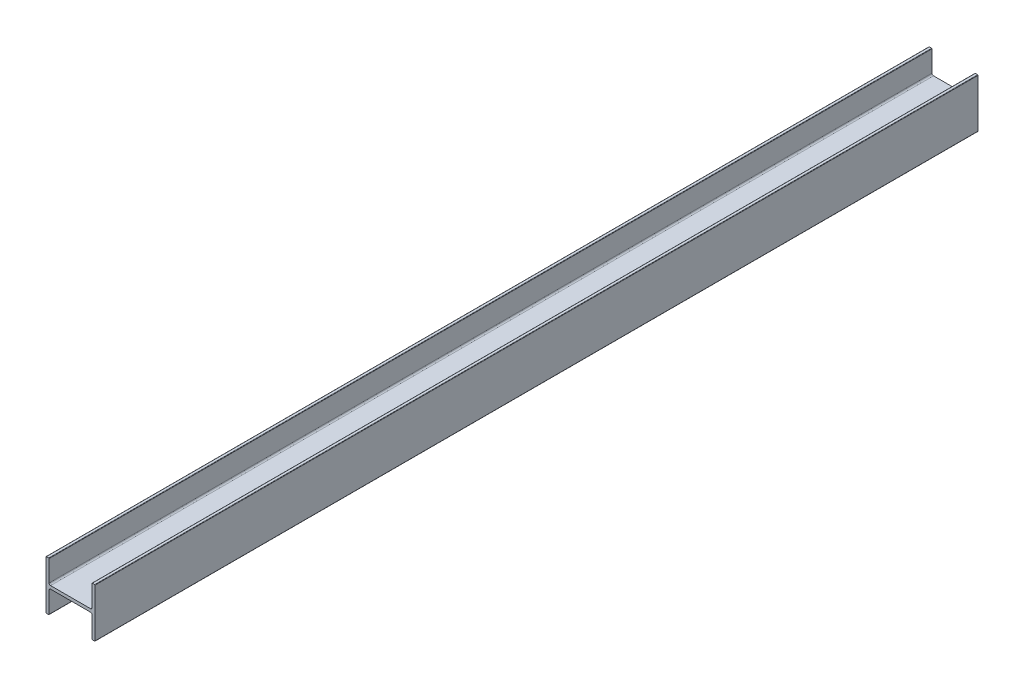
ISO-10303-21;
HEADER;
FILE_DESCRIPTION(('STEP AP214'),'2;1');
FILE_NAME('part.step','',(''),(''),'','','');
FILE_SCHEMA(('AUTOMOTIVE_DESIGN { 1 0 10303 214 1 1 1 1 }'));
ENDSEC;
DATA;
#1=APPLICATION_CONTEXT('core data for automotive mechanical design processes');
#2=APPLICATION_PROTOCOL_DEFINITION('international standard','automotive_design',2000,#1);
#3=PRODUCT_CONTEXT('',#1,'mechanical');
#4=PRODUCT('Part','Part','',(#3));
#5=PRODUCT_RELATED_PRODUCT_CATEGORY('part','',(#4));
#6=PRODUCT_DEFINITION_FORMATION('','',#4);
#7=PRODUCT_DEFINITION_CONTEXT('part definition',#1,'design');
#8=PRODUCT_DEFINITION('design','',#6,#7);
#9=PRODUCT_DEFINITION_SHAPE('','',#8);
#10=(LENGTH_UNIT() NAMED_UNIT(*) SI_UNIT(.MILLI.,.METRE.));
#11=(NAMED_UNIT(*) PLANE_ANGLE_UNIT() SI_UNIT($,.RADIAN.));
#12=(NAMED_UNIT(*) SI_UNIT($,.STERADIAN.) SOLID_ANGLE_UNIT());
#13=UNCERTAINTY_MEASURE_WITH_UNIT(LENGTH_MEASURE(1.E-05),#10,'distance_accuracy_value','');
#14=(GEOMETRIC_REPRESENTATION_CONTEXT(3) GLOBAL_UNCERTAINTY_ASSIGNED_CONTEXT((#13)) GLOBAL_UNIT_ASSIGNED_CONTEXT((#10,
#11,#12)) REPRESENTATION_CONTEXT('',''));
#15=CARTESIAN_POINT('',(0.,0.,0.));
#16=DIRECTION('',(0.,0.,1.));
#17=DIRECTION('',(1.,0.,0.));
#18=AXIS2_PLACEMENT_3D('',#15,#16,#17);
#19=CARTESIAN_POINT('',(22.225,-25.4,457.2));
#20=DIRECTION('',(0.,1.,0.));
#21=DIRECTION('',(-1.,0.,0.));
#22=AXIS2_PLACEMENT_3D('',#19,#20,#21);
#23=PLANE('',#22);
#24=DIRECTION('',(1.,0.,0.));
#25=VECTOR('',#24,1.);
#26=CARTESIAN_POINT('',(22.225,-25.4,-457.2));
#27=LINE('',#26,#25);
#28=CARTESIAN_POINT('',(22.621875,-25.4,-457.2));
#29=VERTEX_POINT('',#28);
#30=CARTESIAN_POINT('',(25.003125,-25.4,-457.2));
#31=VERTEX_POINT('',#30);
#32=EDGE_CURVE('E404',#29,#31,#27,.T.);
#33=ORIENTED_EDGE('',*,*,#32,.T.);
#34=DIRECTION('',(0.,0.,-1.));
#35=VECTOR('',#34,1.);
#36=CARTESIAN_POINT('',(25.003125,-25.4,457.2));
#37=LINE('',#36,#35);
#38=CARTESIAN_POINT('',(25.003125,-25.4,457.2));
#39=VERTEX_POINT('',#38);
#40=EDGE_CURVE('E325',#31,#39,#37,.F.);
#41=ORIENTED_EDGE('',*,*,#40,.T.);
#42=DIRECTION('',(1.,0.,0.));
#43=VECTOR('',#42,1.);
#44=CARTESIAN_POINT('',(22.225,-25.4,457.2));
#45=LINE('',#44,#43);
#46=CARTESIAN_POINT('',(22.621875,-25.4,457.2));
#47=VERTEX_POINT('',#46);
#48=EDGE_CURVE('E232',#47,#39,#45,.T.);
#49=ORIENTED_EDGE('',*,*,#48,.F.);
#50=DIRECTION('',(0.,0.,-1.));
#51=VECTOR('',#50,1.);
#52=CARTESIAN_POINT('',(22.621875,-25.4,457.2));
#53=LINE('',#52,#51);
#54=EDGE_CURVE('E316',#47,#29,#53,.T.);
#55=ORIENTED_EDGE('',*,*,#54,.T.);
#56=EDGE_LOOP('',(#33,#41,#49,#55));
#57=FACE_BOUND('',#56,.T.);
#58=ADVANCED_FACE('F41',(#57),#23,.F.);
#59=CARTESIAN_POINT('',(25.4,-25.4,457.2));
#60=DIRECTION('',(-1.,0.,0.));
#61=DIRECTION('',(0.,-1.,0.));
#62=AXIS2_PLACEMENT_3D('',#59,#60,#61);
#63=PLANE('',#62);
#64=DIRECTION('',(0.,1.,0.));
#65=VECTOR('',#64,1.);
#66=CARTESIAN_POINT('',(25.4,-25.4,457.2));
#67=LINE('',#66,#65);
#68=CARTESIAN_POINT('',(25.4,-25.003125,457.2));
#69=VERTEX_POINT('',#68);
#70=CARTESIAN_POINT('',(25.4,25.003125,457.2));
#71=VERTEX_POINT('',#70);
#72=EDGE_CURVE('E243',#69,#71,#67,.T.);
#73=ORIENTED_EDGE('',*,*,#72,.F.);
#74=DIRECTION('',(0.,0.,-1.));
#75=VECTOR('',#74,1.);
#76=CARTESIAN_POINT('',(25.4,-25.003125,457.2));
#77=LINE('',#76,#75);
#78=CARTESIAN_POINT('',(25.4,-25.003125,-457.2));
#79=VERTEX_POINT('',#78);
#80=EDGE_CURVE('E297',#69,#79,#77,.T.);
#81=ORIENTED_EDGE('',*,*,#80,.T.);
#82=DIRECTION('',(0.,1.,0.));
#83=VECTOR('',#82,1.);
#84=CARTESIAN_POINT('',(25.4,-25.4,-457.2));
#85=LINE('',#84,#83);
#86=CARTESIAN_POINT('',(25.4,25.003125,-457.2));
#87=VERTEX_POINT('',#86);
#88=EDGE_CURVE('E420',#79,#87,#85,.T.);
#89=ORIENTED_EDGE('',*,*,#88,.T.);
#90=DIRECTION('',(0.,0.,-1.));
#91=VECTOR('',#90,1.);
#92=CARTESIAN_POINT('',(25.4,25.003125,457.2));
#93=LINE('',#92,#91);
#94=EDGE_CURVE('E296',#87,#71,#93,.F.);
#95=ORIENTED_EDGE('',*,*,#94,.T.);
#96=EDGE_LOOP('',(#73,#81,#89,#95));
#97=FACE_BOUND('',#96,.T.);
#98=ADVANCED_FACE('F418',(#97),#63,.F.);
#99=CARTESIAN_POINT('',(25.4,25.4,457.2));
#100=DIRECTION('',(0.,-1.,0.));
#101=DIRECTION('',(1.,0.,0.));
#102=AXIS2_PLACEMENT_3D('',#99,#100,#101);
#103=PLANE('',#102);
#104=DIRECTION('',(-1.,0.,0.));
#105=VECTOR('',#104,1.);
#106=CARTESIAN_POINT('',(25.4,25.4,457.2));
#107=LINE('',#106,#105);
#108=CARTESIAN_POINT('',(25.003125,25.4,457.2));
#109=VERTEX_POINT('',#108);
#110=CARTESIAN_POINT('',(22.621875,25.4,457.2));
#111=VERTEX_POINT('',#110);
#112=EDGE_CURVE('E246',#109,#111,#107,.T.);
#113=ORIENTED_EDGE('',*,*,#112,.F.);
#114=DIRECTION('',(0.,0.,-1.));
#115=VECTOR('',#114,1.);
#116=CARTESIAN_POINT('',(25.003125,25.4,457.2));
#117=LINE('',#116,#115);
#118=CARTESIAN_POINT('',(25.003125,25.4,-457.2));
#119=VERTEX_POINT('',#118);
#120=EDGE_CURVE('E355',#109,#119,#117,.T.);
#121=ORIENTED_EDGE('',*,*,#120,.T.);
#122=DIRECTION('',(-1.,0.,0.));
#123=VECTOR('',#122,1.);
#124=CARTESIAN_POINT('',(25.4,25.4,-457.2));
#125=LINE('',#124,#123);
#126=CARTESIAN_POINT('',(22.621875,25.4,-457.2));
#127=VERTEX_POINT('',#126);
#128=EDGE_CURVE('E421',#119,#127,#125,.T.);
#129=ORIENTED_EDGE('',*,*,#128,.T.);
#130=DIRECTION('',(0.,0.,-1.));
#131=VECTOR('',#130,1.);
#132=CARTESIAN_POINT('',(22.621875,25.4,457.2));
#133=LINE('',#132,#131);
#134=EDGE_CURVE('E354',#127,#111,#133,.F.);
#135=ORIENTED_EDGE('',*,*,#134,.T.);
#136=EDGE_LOOP('',(#113,#121,#129,#135));
#137=FACE_BOUND('',#136,.T.);
#138=ADVANCED_FACE('F472',(#137),#103,.F.);
#139=CARTESIAN_POINT('',(22.225,25.4,457.2));
#140=DIRECTION('',(1.,0.,0.));
#141=DIRECTION('',(0.,1.,0.));
#142=AXIS2_PLACEMENT_3D('',#139,#140,#141);
#143=PLANE('',#142);
#144=DIRECTION('',(0.,-1.,0.));
#145=VECTOR('',#144,1.);
#146=CARTESIAN_POINT('',(22.225,25.4,457.2));
#147=LINE('',#146,#145);
#148=CARTESIAN_POINT('',(22.225,25.003125,457.2));
#149=VERTEX_POINT('',#148);
#150=CARTESIAN_POINT('',(22.225,3.17499999999999,457.2));
#151=VERTEX_POINT('',#150);
#152=EDGE_CURVE('E248',#149,#151,#147,.T.);
#153=ORIENTED_EDGE('',*,*,#152,.F.);
#154=DIRECTION('',(0.,0.,-1.));
#155=VECTOR('',#154,1.);
#156=CARTESIAN_POINT('',(22.225,25.003125,457.2));
#157=LINE('',#156,#155);
#158=CARTESIAN_POINT('',(22.225,25.003125,-457.2));
#159=VERTEX_POINT('',#158);
#160=EDGE_CURVE('E356',#149,#159,#157,.T.);
#161=ORIENTED_EDGE('',*,*,#160,.T.);
#162=DIRECTION('',(0.,-1.,0.));
#163=VECTOR('',#162,1.);
#164=CARTESIAN_POINT('',(22.225,25.4,-457.2));
#165=LINE('',#164,#163);
#166=CARTESIAN_POINT('',(22.225,3.17499999999999,-457.2));
#167=VERTEX_POINT('',#166);
#168=EDGE_CURVE('E428',#159,#167,#165,.T.);
#169=ORIENTED_EDGE('',*,*,#168,.T.);
#170=DIRECTION('',(0.,0.,-1.));
#171=VECTOR('',#170,1.);
#172=CARTESIAN_POINT('',(22.225,3.17499999999999,457.2));
#173=LINE('',#172,#171);
#174=EDGE_CURVE('E279',#167,#151,#173,.F.);
#175=ORIENTED_EDGE('',*,*,#174,.T.);
#176=EDGE_LOOP('',(#153,#161,#169,#175));
#177=FACE_BOUND('',#176,.T.);
#178=ADVANCED_FACE('F545',(#177),#143,.F.);
#179=CARTESIAN_POINT('',(22.225,1.58749999999999,457.2));
#180=DIRECTION('',(0.,-1.,0.));
#181=DIRECTION('',(1.,0.,0.));
#182=AXIS2_PLACEMENT_3D('',#179,#180,#181);
#183=PLANE('',#182);
#184=DIRECTION('',(-1.,0.,0.));
#185=VECTOR('',#184,1.);
#186=CARTESIAN_POINT('',(22.225,1.58749999999999,457.2));
#187=LINE('',#186,#185);
#188=CARTESIAN_POINT('',(20.6375,1.58749999999999,457.2));
#189=VERTEX_POINT('',#188);
#190=CARTESIAN_POINT('',(-20.6375,1.5875,457.2));
#191=VERTEX_POINT('',#190);
#192=EDGE_CURVE('E252',#189,#191,#187,.T.);
#193=ORIENTED_EDGE('',*,*,#192,.F.);
#194=DIRECTION('',(0.,0.,-1.));
#195=VECTOR('',#194,1.);
#196=CARTESIAN_POINT('',(20.6375,1.58749999999999,-457.2));
#197=LINE('',#196,#195);
#198=CARTESIAN_POINT('',(20.6375,1.58749999999999,-457.2));
#199=VERTEX_POINT('',#198);
#200=EDGE_CURVE('E280',#189,#199,#197,.T.);
#201=ORIENTED_EDGE('',*,*,#200,.T.);
#202=DIRECTION('',(-1.,0.,0.));
#203=VECTOR('',#202,1.);
#204=CARTESIAN_POINT('',(22.225,1.58749999999999,-457.2));
#205=LINE('',#204,#203);
#206=CARTESIAN_POINT('',(-20.6375,1.5875,-457.2));
#207=VERTEX_POINT('',#206);
#208=EDGE_CURVE('E382',#199,#207,#205,.T.);
#209=ORIENTED_EDGE('',*,*,#208,.T.);
#210=DIRECTION('',(0.,0.,-1.));
#211=VECTOR('',#210,1.);
#212=CARTESIAN_POINT('',(-20.6375,1.5875,457.2));
#213=LINE('',#212,#211);
#214=EDGE_CURVE('E273',#207,#191,#213,.F.);
#215=ORIENTED_EDGE('',*,*,#214,.T.);
#216=EDGE_LOOP('',(#193,#201,#209,#215));
#217=FACE_BOUND('',#216,.T.);
#218=ADVANCED_FACE('F434',(#217),#183,.F.);
#219=CARTESIAN_POINT('',(-22.225,1.5875,457.2));
#220=DIRECTION('',(-1.,0.,0.));
#221=DIRECTION('',(0.,-1.,0.));
#222=AXIS2_PLACEMENT_3D('',#219,#220,#221);
#223=PLANE('',#222);
#224=DIRECTION('',(0.,1.,0.));
#225=VECTOR('',#224,1.);
#226=CARTESIAN_POINT('',(-22.225,1.5875,-457.2));
#227=LINE('',#226,#225);
#228=CARTESIAN_POINT('',(-22.225,3.175,-457.2));
#229=VERTEX_POINT('',#228);
#230=CARTESIAN_POINT('',(-22.225,25.003125,-457.2));
#231=VERTEX_POINT('',#230);
#232=EDGE_CURVE('E380',#229,#231,#227,.T.);
#233=ORIENTED_EDGE('',*,*,#232,.T.);
#234=DIRECTION('',(0.,0.,-1.));
#235=VECTOR('',#234,1.);
#236=CARTESIAN_POINT('',(-22.225,25.003125,457.2));
#237=LINE('',#236,#235);
#238=CARTESIAN_POINT('',(-22.225,25.003125,457.2));
#239=VERTEX_POINT('',#238);
#240=EDGE_CURVE('E11',#231,#239,#237,.F.);
#241=ORIENTED_EDGE('',*,*,#240,.T.);
#242=DIRECTION('',(0.,1.,0.));
#243=VECTOR('',#242,1.);
#244=CARTESIAN_POINT('',(-22.225,1.5875,457.2));
#245=LINE('',#244,#243);
#246=CARTESIAN_POINT('',(-22.225,3.175,457.2));
#247=VERTEX_POINT('',#246);
#248=EDGE_CURVE('E251',#247,#239,#245,.T.);
#249=ORIENTED_EDGE('',*,*,#248,.F.);
#250=DIRECTION('',(0.,0.,-1.));
#251=VECTOR('',#250,1.);
#252=CARTESIAN_POINT('',(-22.225,3.175,-457.2));
#253=LINE('',#252,#251);
#254=EDGE_CURVE('E217',#247,#229,#253,.T.);
#255=ORIENTED_EDGE('',*,*,#254,.T.);
#256=EDGE_LOOP('',(#233,#241,#249,#255));
#257=FACE_BOUND('',#256,.T.);
#258=ADVANCED_FACE('F442',(#257),#223,.F.);
#259=CARTESIAN_POINT('',(-22.225,25.4,457.2));
#260=DIRECTION('',(0.,-1.,0.));
#261=DIRECTION('',(1.,0.,0.));
#262=AXIS2_PLACEMENT_3D('',#259,#260,#261);
#263=PLANE('',#262);
#264=DIRECTION('',(-1.,0.,0.));
#265=VECTOR('',#264,1.);
#266=CARTESIAN_POINT('',(-22.225,25.4,457.2));
#267=LINE('',#266,#265);
#268=CARTESIAN_POINT('',(-22.621875,25.4,457.2));
#269=VERTEX_POINT('',#268);
#270=CARTESIAN_POINT('',(-25.003125,25.4,457.2));
#271=VERTEX_POINT('',#270);
#272=EDGE_CURVE('E260',#269,#271,#267,.T.);
#273=ORIENTED_EDGE('',*,*,#272,.F.);
#274=DIRECTION('',(0.,0.,-1.));
#275=VECTOR('',#274,1.);
#276=CARTESIAN_POINT('',(-22.621875,25.4,457.2));
#277=LINE('',#276,#275);
#278=CARTESIAN_POINT('',(-22.621875,25.4,-457.2));
#279=VERTEX_POINT('',#278);
#280=EDGE_CURVE('E47',#269,#279,#277,.T.);
#281=ORIENTED_EDGE('',*,*,#280,.T.);
#282=DIRECTION('',(-1.,0.,0.));
#283=VECTOR('',#282,1.);
#284=CARTESIAN_POINT('',(-22.225,25.4,-457.2));
#285=LINE('',#284,#283);
#286=CARTESIAN_POINT('',(-25.003125,25.4,-457.2));
#287=VERTEX_POINT('',#286);
#288=EDGE_CURVE('E367',#279,#287,#285,.T.);
#289=ORIENTED_EDGE('',*,*,#288,.T.);
#290=DIRECTION('',(0.,0.,-1.));
#291=VECTOR('',#290,1.);
#292=CARTESIAN_POINT('',(-25.003125,25.4,457.2));
#293=LINE('',#292,#291);
#294=EDGE_CURVE('E363',#287,#271,#293,.F.);
#295=ORIENTED_EDGE('',*,*,#294,.T.);
#296=EDGE_LOOP('',(#273,#281,#289,#295));
#297=FACE_BOUND('',#296,.T.);
#298=ADVANCED_FACE('F368',(#297),#263,.F.);
#299=CARTESIAN_POINT('',(-25.4,25.4,457.2));
#300=DIRECTION('',(1.,0.,0.));
#301=DIRECTION('',(0.,1.,0.));
#302=AXIS2_PLACEMENT_3D('',#299,#300,#301);
#303=PLANE('',#302);
#304=DIRECTION('',(0.,-1.,0.));
#305=VECTOR('',#304,1.);
#306=CARTESIAN_POINT('',(-25.4,25.4,-457.2));
#307=LINE('',#306,#305);
#308=CARTESIAN_POINT('',(-25.4,25.003125,-457.2));
#309=VERTEX_POINT('',#308);
#310=CARTESIAN_POINT('',(-25.4,-25.003125,-457.2));
#311=VERTEX_POINT('',#310);
#312=EDGE_CURVE('E376',#309,#311,#307,.T.);
#313=ORIENTED_EDGE('',*,*,#312,.T.);
#314=DIRECTION('',(0.,0.,-1.));
#315=VECTOR('',#314,1.);
#316=CARTESIAN_POINT('',(-25.4,-25.003125,457.2));
#317=LINE('',#316,#315);
#318=CARTESIAN_POINT('',(-25.4,-25.003125,457.2));
#319=VERTEX_POINT('',#318);
#320=EDGE_CURVE('E351',#311,#319,#317,.F.);
#321=ORIENTED_EDGE('',*,*,#320,.T.);
#322=DIRECTION('',(0.,-1.,0.));
#323=VECTOR('',#322,1.);
#324=CARTESIAN_POINT('',(-25.4,25.4,457.2));
#325=LINE('',#324,#323);
#326=CARTESIAN_POINT('',(-25.4,25.003125,457.2));
#327=VERTEX_POINT('',#326);
#328=EDGE_CURVE('E259',#327,#319,#325,.T.);
#329=ORIENTED_EDGE('',*,*,#328,.F.);
#330=DIRECTION('',(0.,0.,-1.));
#331=VECTOR('',#330,1.);
#332=CARTESIAN_POINT('',(-25.4,25.003125,457.2));
#333=LINE('',#332,#331);
#334=EDGE_CURVE('E349',#327,#309,#333,.T.);
#335=ORIENTED_EDGE('',*,*,#334,.T.);
#336=EDGE_LOOP('',(#313,#321,#329,#335));
#337=FACE_BOUND('',#336,.T.);
#338=ADVANCED_FACE('F451',(#337),#303,.F.);
#339=CARTESIAN_POINT('',(-25.4,-25.4,457.2));
#340=DIRECTION('',(0.,1.,0.));
#341=DIRECTION('',(0.,0.,1.));
#342=AXIS2_PLACEMENT_3D('',#339,#340,#341);
#343=PLANE('',#342);
#344=DIRECTION('',(1.,0.,0.));
#345=VECTOR('',#344,1.);
#346=CARTESIAN_POINT('',(-25.4,-25.4,-457.2));
#347=LINE('',#346,#345);
#348=CARTESIAN_POINT('',(-25.003125,-25.4,-457.2));
#349=VERTEX_POINT('',#348);
#350=CARTESIAN_POINT('',(-22.621875,-25.4,-457.2));
#351=VERTEX_POINT('',#350);
#352=EDGE_CURVE('E240',#349,#351,#347,.T.);
#353=ORIENTED_EDGE('',*,*,#352,.T.);
#354=DIRECTION('',(0.,0.,-1.));
#355=VECTOR('',#354,1.);
#356=CARTESIAN_POINT('',(-22.621875,-25.4,457.2));
#357=LINE('',#356,#355);
#358=CARTESIAN_POINT('',(-22.621875,-25.4,457.2));
#359=VERTEX_POINT('',#358);
#360=EDGE_CURVE('E347',#351,#359,#357,.F.);
#361=ORIENTED_EDGE('',*,*,#360,.T.);
#362=DIRECTION('',(1.,0.,0.));
#363=VECTOR('',#362,1.);
#364=CARTESIAN_POINT('',(-25.4,-25.4,457.2));
#365=LINE('',#364,#363);
#366=CARTESIAN_POINT('',(-25.003125,-25.4,457.2));
#367=VERTEX_POINT('',#366);
#368=EDGE_CURVE('E264',#367,#359,#365,.T.);
#369=ORIENTED_EDGE('',*,*,#368,.F.);
#370=DIRECTION('',(0.,0.,-1.));
#371=VECTOR('',#370,1.);
#372=CARTESIAN_POINT('',(-25.003125,-25.4,457.2));
#373=LINE('',#372,#371);
#374=EDGE_CURVE('E342',#367,#349,#373,.T.);
#375=ORIENTED_EDGE('',*,*,#374,.T.);
#376=EDGE_LOOP('',(#353,#361,#369,#375));
#377=FACE_BOUND('',#376,.T.);
#378=ADVANCED_FACE('F387',(#377),#343,.F.);
#379=CARTESIAN_POINT('',(-22.225,-25.4,457.2));
#380=DIRECTION('',(-1.,0.,0.));
#381=DIRECTION('',(0.,-1.,0.));
#382=AXIS2_PLACEMENT_3D('',#379,#380,#381);
#383=PLANE('',#382);
#384=DIRECTION('',(0.,1.,0.));
#385=VECTOR('',#384,1.);
#386=CARTESIAN_POINT('',(-22.225,-25.4,457.2));
#387=LINE('',#386,#385);
#388=CARTESIAN_POINT('',(-22.225,-25.003125,457.2));
#389=VERTEX_POINT('',#388);
#390=CARTESIAN_POINT('',(-22.225,-3.17500000000001,457.2));
#391=VERTEX_POINT('',#390);
#392=EDGE_CURVE('E263',#389,#391,#387,.T.);
#393=ORIENTED_EDGE('',*,*,#392,.F.);
#394=DIRECTION('',(0.,0.,-1.));
#395=VECTOR('',#394,1.);
#396=CARTESIAN_POINT('',(-22.225,-25.003125,457.2));
#397=LINE('',#396,#395);
#398=CARTESIAN_POINT('',(-22.225,-25.003125,-457.2));
#399=VERTEX_POINT('',#398);
#400=EDGE_CURVE('E338',#389,#399,#397,.T.);
#401=ORIENTED_EDGE('',*,*,#400,.T.);
#402=DIRECTION('',(0.,1.,0.));
#403=VECTOR('',#402,1.);
#404=CARTESIAN_POINT('',(-22.225,-25.4,-457.2));
#405=LINE('',#404,#403);
#406=CARTESIAN_POINT('',(-22.225,-3.17500000000001,-457.2));
#407=VERTEX_POINT('',#406);
#408=EDGE_CURVE('E231',#399,#407,#405,.T.);
#409=ORIENTED_EDGE('',*,*,#408,.T.);
#410=DIRECTION('',(0.,0.,-1.));
#411=VECTOR('',#410,1.);
#412=CARTESIAN_POINT('',(-22.225,-3.175,457.2));
#413=LINE('',#412,#411);
#414=EDGE_CURVE('E211',#407,#391,#413,.F.);
#415=ORIENTED_EDGE('',*,*,#414,.T.);
#416=EDGE_LOOP('',(#393,#401,#409,#415));
#417=FACE_BOUND('',#416,.T.);
#418=ADVANCED_FACE('F393',(#417),#383,.F.);
#419=CARTESIAN_POINT('',(-22.225,-1.5875,457.2));
#420=DIRECTION('',(0.,1.,0.));
#421=DIRECTION('',(-1.,0.,0.));
#422=AXIS2_PLACEMENT_3D('',#419,#420,#421);
#423=PLANE('',#422);
#424=DIRECTION('',(1.,0.,0.));
#425=VECTOR('',#424,1.);
#426=CARTESIAN_POINT('',(-22.225,-1.5875,457.2));
#427=LINE('',#426,#425);
#428=CARTESIAN_POINT('',(-20.6375,-1.5875,457.2));
#429=VERTEX_POINT('',#428);
#430=CARTESIAN_POINT('',(20.6375,-1.58749999999999,457.2));
#431=VERTEX_POINT('',#430);
#432=EDGE_CURVE('E225',#429,#431,#427,.T.);
#433=ORIENTED_EDGE('',*,*,#432,.F.);
#434=DIRECTION('',(0.,0.,-1.));
#435=VECTOR('',#434,1.);
#436=CARTESIAN_POINT('',(-20.6375,-1.5875,-457.2));
#437=LINE('',#436,#435);
#438=CARTESIAN_POINT('',(-20.6375,-1.5875,-457.2));
#439=VERTEX_POINT('',#438);
#440=EDGE_CURVE('E209',#429,#439,#437,.T.);
#441=ORIENTED_EDGE('',*,*,#440,.T.);
#442=DIRECTION('',(1.,0.,0.));
#443=VECTOR('',#442,1.);
#444=CARTESIAN_POINT('',(-22.225,-1.5875,-457.2));
#445=LINE('',#444,#443);
#446=CARTESIAN_POINT('',(20.6375,-1.58749999999999,-457.2));
#447=VERTEX_POINT('',#446);
#448=EDGE_CURVE('E222',#439,#447,#445,.T.);
#449=ORIENTED_EDGE('',*,*,#448,.T.);
#450=DIRECTION('',(0.,0.,-1.));
#451=VECTOR('',#450,1.);
#452=CARTESIAN_POINT('',(20.6375,-1.58749999999999,457.2));
#453=LINE('',#452,#451);
#454=EDGE_CURVE('E228',#447,#431,#453,.F.);
#455=ORIENTED_EDGE('',*,*,#454,.T.);
#456=EDGE_LOOP('',(#433,#441,#449,#455));
#457=FACE_BOUND('',#456,.T.);
#458=ADVANCED_FACE('F221',(#457),#423,.F.);
#459=CARTESIAN_POINT('',(22.225,-1.58749999999999,457.2));
#460=DIRECTION('',(1.,0.,0.));
#461=DIRECTION('',(0.,1.,0.));
#462=AXIS2_PLACEMENT_3D('',#459,#460,#461);
#463=PLANE('',#462);
#464=DIRECTION('',(0.,-1.,0.));
#465=VECTOR('',#464,1.);
#466=CARTESIAN_POINT('',(22.225,-1.58749999999999,-457.2));
#467=LINE('',#466,#465);
#468=CARTESIAN_POINT('',(22.225,-3.17499999999999,-457.2));
#469=VERTEX_POINT('',#468);
#470=CARTESIAN_POINT('',(22.225,-25.003125,-457.2));
#471=VERTEX_POINT('',#470);
#472=EDGE_CURVE('E235',#469,#471,#467,.T.);
#473=ORIENTED_EDGE('',*,*,#472,.T.);
#474=DIRECTION('',(0.,0.,-1.));
#475=VECTOR('',#474,1.);
#476=CARTESIAN_POINT('',(22.225,-25.003125,457.2));
#477=LINE('',#476,#475);
#478=CARTESIAN_POINT('',(22.225,-25.003125,457.2));
#479=VERTEX_POINT('',#478);
#480=EDGE_CURVE('E57',#471,#479,#477,.F.);
#481=ORIENTED_EDGE('',*,*,#480,.T.);
#482=DIRECTION('',(0.,-1.,0.));
#483=VECTOR('',#482,1.);
#484=CARTESIAN_POINT('',(22.225,-1.58749999999999,457.2));
#485=LINE('',#484,#483);
#486=CARTESIAN_POINT('',(22.225,-3.17499999999999,457.2));
#487=VERTEX_POINT('',#486);
#488=EDGE_CURVE('E269',#487,#479,#485,.T.);
#489=ORIENTED_EDGE('',*,*,#488,.F.);
#490=DIRECTION('',(0.,0.,-1.));
#491=VECTOR('',#490,1.);
#492=CARTESIAN_POINT('',(22.225,-3.17499999999999,-457.2));
#493=LINE('',#492,#491);
#494=EDGE_CURVE('E275',#487,#469,#493,.T.);
#495=ORIENTED_EDGE('',*,*,#494,.T.);
#496=EDGE_LOOP('',(#473,#481,#489,#495));
#497=FACE_BOUND('',#496,.T.);
#498=ADVANCED_FACE('F402',(#497),#463,.F.);
#499=CARTESIAN_POINT('',(25.4,-25.4,457.2));
#500=DIRECTION('',(0.,0.,1.));
#501=DIRECTION('',(1.,0.,0.));
#502=AXIS2_PLACEMENT_3D('',#499,#500,#501);
#503=PLANE('',#502);
#504=ORIENTED_EDGE('',*,*,#48,.T.);
#505=CARTESIAN_POINT('',(25.003125,-25.003125,457.2));
#506=DIRECTION('',(0.,0.,1.));
#507=DIRECTION('',(1.,0.,0.));
#508=AXIS2_PLACEMENT_3D('',#505,#506,#507);
#509=CIRCLE('',#508,0.396875);
#510=EDGE_CURVE('E340',#39,#69,#509,.T.);
#511=ORIENTED_EDGE('',*,*,#510,.T.);
#512=ORIENTED_EDGE('',*,*,#72,.T.);
#513=CARTESIAN_POINT('',(25.003125,25.003125,457.2));
#514=DIRECTION('',(0.,0.,1.));
#515=DIRECTION('',(1.,0.,0.));
#516=AXIS2_PLACEMENT_3D('',#513,#514,#515);
#517=CIRCLE('',#516,0.396875);
#518=EDGE_CURVE('E328',#71,#109,#517,.T.);
#519=ORIENTED_EDGE('',*,*,#518,.T.);
#520=ORIENTED_EDGE('',*,*,#112,.T.);
#521=CARTESIAN_POINT('',(22.621875,25.003125,457.2));
#522=DIRECTION('',(0.,0.,1.));
#523=DIRECTION('',(1.,0.,0.));
#524=AXIS2_PLACEMENT_3D('',#521,#522,#523);
#525=CIRCLE('',#524,0.396875);
#526=EDGE_CURVE('E329',#111,#149,#525,.T.);
#527=ORIENTED_EDGE('',*,*,#526,.T.);
#528=ORIENTED_EDGE('',*,*,#152,.T.);
#529=CARTESIAN_POINT('',(20.6375,3.17499999999999,457.2));
#530=DIRECTION('',(0.,0.,1.));
#531=DIRECTION('',(1.,0.,0.));
#532=AXIS2_PLACEMENT_3D('',#529,#530,#531);
#533=CIRCLE('',#532,1.5875);
#534=EDGE_CURVE('E292',#151,#189,#533,.F.);
#535=ORIENTED_EDGE('',*,*,#534,.T.);
#536=ORIENTED_EDGE('',*,*,#192,.T.);
#537=CARTESIAN_POINT('',(-20.6375,3.175,457.2));
#538=DIRECTION('',(0.,0.,1.));
#539=DIRECTION('',(1.,0.,0.));
#540=AXIS2_PLACEMENT_3D('',#537,#538,#539);
#541=CIRCLE('',#540,1.5875);
#542=EDGE_CURVE('E298',#191,#247,#541,.F.);
#543=ORIENTED_EDGE('',*,*,#542,.T.);
#544=ORIENTED_EDGE('',*,*,#248,.T.);
#545=CARTESIAN_POINT('',(-22.621875,25.003125,457.2));
#546=DIRECTION('',(0.,0.,1.));
#547=DIRECTION('',(1.,0.,0.));
#548=AXIS2_PLACEMENT_3D('',#545,#546,#547);
#549=CIRCLE('',#548,0.396875);
#550=EDGE_CURVE('E327',#239,#269,#549,.T.);
#551=ORIENTED_EDGE('',*,*,#550,.T.);
#552=ORIENTED_EDGE('',*,*,#272,.T.);
#553=CARTESIAN_POINT('',(-25.003125,25.003125,457.2));
#554=DIRECTION('',(0.,0.,1.));
#555=DIRECTION('',(1.,0.,0.));
#556=AXIS2_PLACEMENT_3D('',#553,#554,#555);
#557=CIRCLE('',#556,0.396875);
#558=EDGE_CURVE('E323',#271,#327,#557,.T.);
#559=ORIENTED_EDGE('',*,*,#558,.T.);
#560=ORIENTED_EDGE('',*,*,#328,.T.);
#561=CARTESIAN_POINT('',(-25.003125,-25.003125,457.2));
#562=DIRECTION('',(0.,0.,1.));
#563=DIRECTION('',(1.,0.,0.));
#564=AXIS2_PLACEMENT_3D('',#561,#562,#563);
#565=CIRCLE('',#564,0.396875);
#566=EDGE_CURVE('E332',#319,#367,#565,.T.);
#567=ORIENTED_EDGE('',*,*,#566,.T.);
#568=ORIENTED_EDGE('',*,*,#368,.T.);
#569=CARTESIAN_POINT('',(-22.621875,-25.003125,457.2));
#570=DIRECTION('',(0.,0.,1.));
#571=DIRECTION('',(1.,0.,0.));
#572=AXIS2_PLACEMENT_3D('',#569,#570,#571);
#573=CIRCLE('',#572,0.396875);
#574=EDGE_CURVE('E63',#359,#389,#573,.T.);
#575=ORIENTED_EDGE('',*,*,#574,.T.);
#576=ORIENTED_EDGE('',*,*,#392,.T.);
#577=CARTESIAN_POINT('',(-20.6375,-3.175,457.2));
#578=DIRECTION('',(0.,0.,1.));
#579=DIRECTION('',(1.,0.,0.));
#580=AXIS2_PLACEMENT_3D('',#577,#578,#579);
#581=CIRCLE('',#580,1.5875);
#582=EDGE_CURVE('E214',#391,#429,#581,.F.);
#583=ORIENTED_EDGE('',*,*,#582,.T.);
#584=ORIENTED_EDGE('',*,*,#432,.T.);
#585=CARTESIAN_POINT('',(20.6375,-3.17499999999999,457.2));
#586=DIRECTION('',(0.,0.,1.));
#587=DIRECTION('',(1.,0.,0.));
#588=AXIS2_PLACEMENT_3D('',#585,#586,#587);
#589=CIRCLE('',#588,1.5875);
#590=EDGE_CURVE('E287',#431,#487,#589,.F.);
#591=ORIENTED_EDGE('',*,*,#590,.T.);
#592=ORIENTED_EDGE('',*,*,#488,.T.);
#593=CARTESIAN_POINT('',(22.621875,-25.003125,457.2));
#594=DIRECTION('',(0.,0.,1.));
#595=DIRECTION('',(1.,0.,0.));
#596=AXIS2_PLACEMENT_3D('',#593,#594,#595);
#597=CIRCLE('',#596,0.396875);
#598=EDGE_CURVE('E335',#479,#47,#597,.T.);
#599=ORIENTED_EDGE('',*,*,#598,.T.);
#600=EDGE_LOOP('',(#504,#511,#512,#519,#520,#527,#528,#535,#536,#543,#544,#551,#552,#559,#560,
#567,#568,#575,#576,#583,#584,#591,#592,#599));
#601=FACE_BOUND('',#600,.T.);
#602=ADVANCED_FACE('F396',(#601),#503,.T.);
#603=CARTESIAN_POINT('',(25.4,-25.4,-457.2));
#604=DIRECTION('',(0.,0.,1.));
#605=DIRECTION('',(1.,0.,0.));
#606=AXIS2_PLACEMENT_3D('',#603,#604,#605);
#607=PLANE('',#606);
#608=ORIENTED_EDGE('',*,*,#88,.F.);
#609=CARTESIAN_POINT('',(25.003125,-25.003125,-457.2));
#610=DIRECTION('',(0.,0.,1.));
#611=DIRECTION('',(1.,0.,0.));
#612=AXIS2_PLACEMENT_3D('',#609,#610,#611);
#613=CIRCLE('',#612,0.396875);
#614=EDGE_CURVE('E320',#79,#31,#613,.F.);
#615=ORIENTED_EDGE('',*,*,#614,.T.);
#616=ORIENTED_EDGE('',*,*,#32,.F.);
#617=CARTESIAN_POINT('',(22.621875,-25.003125,-457.2));
#618=DIRECTION('',(0.,0.,1.));
#619=DIRECTION('',(1.,0.,0.));
#620=AXIS2_PLACEMENT_3D('',#617,#618,#619);
#621=CIRCLE('',#620,0.396875);
#622=EDGE_CURVE('E314',#29,#471,#621,.F.);
#623=ORIENTED_EDGE('',*,*,#622,.T.);
#624=ORIENTED_EDGE('',*,*,#472,.F.);
#625=CARTESIAN_POINT('',(20.6375,-3.17499999999999,-457.2));
#626=DIRECTION('',(0.,0.,1.));
#627=DIRECTION('',(1.,0.,0.));
#628=AXIS2_PLACEMENT_3D('',#625,#626,#627);
#629=CIRCLE('',#628,1.5875);
#630=EDGE_CURVE('E233',#469,#447,#629,.T.);
#631=ORIENTED_EDGE('',*,*,#630,.T.);
#632=ORIENTED_EDGE('',*,*,#448,.F.);
#633=CARTESIAN_POINT('',(-20.6375,-3.175,-457.2));
#634=DIRECTION('',(0.,0.,1.));
#635=DIRECTION('',(1.,0.,0.));
#636=AXIS2_PLACEMENT_3D('',#633,#634,#635);
#637=CIRCLE('',#636,1.5875);
#638=EDGE_CURVE('E205',#439,#407,#637,.T.);
#639=ORIENTED_EDGE('',*,*,#638,.T.);
#640=ORIENTED_EDGE('',*,*,#408,.F.);
#641=CARTESIAN_POINT('',(-22.621875,-25.003125,-457.2));
#642=DIRECTION('',(0.,0.,1.));
#643=DIRECTION('',(1.,0.,0.));
#644=AXIS2_PLACEMENT_3D('',#641,#642,#643);
#645=CIRCLE('',#644,0.396875);
#646=EDGE_CURVE('E312',#399,#351,#645,.F.);
#647=ORIENTED_EDGE('',*,*,#646,.T.);
#648=ORIENTED_EDGE('',*,*,#352,.F.);
#649=CARTESIAN_POINT('',(-25.003125,-25.003125,-457.2));
#650=DIRECTION('',(0.,0.,1.));
#651=DIRECTION('',(1.,0.,0.));
#652=AXIS2_PLACEMENT_3D('',#649,#650,#651);
#653=CIRCLE('',#652,0.396875);
#654=EDGE_CURVE('E311',#349,#311,#653,.F.);
#655=ORIENTED_EDGE('',*,*,#654,.T.);
#656=ORIENTED_EDGE('',*,*,#312,.F.);
#657=CARTESIAN_POINT('',(-25.003125,25.003125,-457.2));
#658=DIRECTION('',(0.,0.,1.));
#659=DIRECTION('',(1.,0.,0.));
#660=AXIS2_PLACEMENT_3D('',#657,#658,#659);
#661=CIRCLE('',#660,0.396875);
#662=EDGE_CURVE('E303',#309,#287,#661,.F.);
#663=ORIENTED_EDGE('',*,*,#662,.T.);
#664=ORIENTED_EDGE('',*,*,#288,.F.);
#665=CARTESIAN_POINT('',(-22.621875,25.003125,-457.2));
#666=DIRECTION('',(0.,0.,1.));
#667=DIRECTION('',(1.,0.,0.));
#668=AXIS2_PLACEMENT_3D('',#665,#666,#667);
#669=CIRCLE('',#668,0.396875);
#670=EDGE_CURVE('E304',#279,#231,#669,.F.);
#671=ORIENTED_EDGE('',*,*,#670,.T.);
#672=ORIENTED_EDGE('',*,*,#232,.F.);
#673=CARTESIAN_POINT('',(-20.6375,3.175,-457.2));
#674=DIRECTION('',(0.,0.,1.));
#675=DIRECTION('',(1.,0.,0.));
#676=AXIS2_PLACEMENT_3D('',#673,#674,#675);
#677=CIRCLE('',#676,1.5875);
#678=EDGE_CURVE('E295',#229,#207,#677,.T.);
#679=ORIENTED_EDGE('',*,*,#678,.T.);
#680=ORIENTED_EDGE('',*,*,#208,.F.);
#681=CARTESIAN_POINT('',(20.6375,3.17499999999999,-457.2));
#682=DIRECTION('',(0.,0.,1.));
#683=DIRECTION('',(1.,0.,0.));
#684=AXIS2_PLACEMENT_3D('',#681,#682,#683);
#685=CIRCLE('',#684,1.5875);
#686=EDGE_CURVE('E288',#199,#167,#685,.T.);
#687=ORIENTED_EDGE('',*,*,#686,.T.);
#688=ORIENTED_EDGE('',*,*,#168,.F.);
#689=CARTESIAN_POINT('',(22.621875,25.003125,-457.2));
#690=DIRECTION('',(0.,0.,1.));
#691=DIRECTION('',(1.,0.,0.));
#692=AXIS2_PLACEMENT_3D('',#689,#690,#691);
#693=CIRCLE('',#692,0.396875);
#694=EDGE_CURVE('E310',#159,#127,#693,.F.);
#695=ORIENTED_EDGE('',*,*,#694,.T.);
#696=ORIENTED_EDGE('',*,*,#128,.F.);
#697=CARTESIAN_POINT('',(25.003125,25.003125,-457.2));
#698=DIRECTION('',(0.,0.,1.));
#699=DIRECTION('',(1.,0.,0.));
#700=AXIS2_PLACEMENT_3D('',#697,#698,#699);
#701=CIRCLE('',#700,0.396875);
#702=EDGE_CURVE('E307',#119,#87,#701,.F.);
#703=ORIENTED_EDGE('',*,*,#702,.T.);
#704=EDGE_LOOP('',(#608,#615,#616,#623,#624,#631,#632,#639,#640,#647,#648,#655,#656,#663,#664,
#671,#672,#679,#680,#687,#688,#695,#696,#703));
#705=FACE_BOUND('',#704,.T.);
#706=ADVANCED_FACE('F230',(#705),#607,.F.);
#707=CARTESIAN_POINT('',(-20.6375,-3.175,457.2));
#708=DIRECTION('',(0.,0.,1.));
#709=DIRECTION('',(1.,0.,0.));
#710=AXIS2_PLACEMENT_3D('',#707,#708,#709);
#711=CYLINDRICAL_SURFACE('',#710,1.5875);
#712=ORIENTED_EDGE('',*,*,#582,.F.);
#713=ORIENTED_EDGE('',*,*,#414,.F.);
#714=ORIENTED_EDGE('',*,*,#638,.F.);
#715=ORIENTED_EDGE('',*,*,#440,.F.);
#716=EDGE_LOOP('',(#712,#713,#714,#715));
#717=FACE_BOUND('',#716,.T.);
#718=ADVANCED_FACE('F206',(#717),#711,.F.);
#719=CARTESIAN_POINT('',(20.6375,-3.17499999999999,457.2));
#720=DIRECTION('',(0.,0.,1.));
#721=DIRECTION('',(1.,0.,0.));
#722=AXIS2_PLACEMENT_3D('',#719,#720,#721);
#723=CYLINDRICAL_SURFACE('',#722,1.5875);
#724=ORIENTED_EDGE('',*,*,#590,.F.);
#725=ORIENTED_EDGE('',*,*,#454,.F.);
#726=ORIENTED_EDGE('',*,*,#630,.F.);
#727=ORIENTED_EDGE('',*,*,#494,.F.);
#728=EDGE_LOOP('',(#724,#725,#726,#727));
#729=FACE_BOUND('',#728,.T.);
#730=ADVANCED_FACE('F400',(#729),#723,.F.);
#731=CARTESIAN_POINT('',(20.6375,3.17499999999999,457.2));
#732=DIRECTION('',(0.,0.,1.));
#733=DIRECTION('',(1.,0.,0.));
#734=AXIS2_PLACEMENT_3D('',#731,#732,#733);
#735=CYLINDRICAL_SURFACE('',#734,1.5875);
#736=ORIENTED_EDGE('',*,*,#534,.F.);
#737=ORIENTED_EDGE('',*,*,#174,.F.);
#738=ORIENTED_EDGE('',*,*,#686,.F.);
#739=ORIENTED_EDGE('',*,*,#200,.F.);
#740=EDGE_LOOP('',(#736,#737,#738,#739));
#741=FACE_BOUND('',#740,.T.);
#742=ADVANCED_FACE('F481',(#741),#735,.F.);
#743=CARTESIAN_POINT('',(-20.6375,3.175,457.2));
#744=DIRECTION('',(0.,0.,1.));
#745=DIRECTION('',(1.,0.,0.));
#746=AXIS2_PLACEMENT_3D('',#743,#744,#745);
#747=CYLINDRICAL_SURFACE('',#746,1.5875);
#748=ORIENTED_EDGE('',*,*,#542,.F.);
#749=ORIENTED_EDGE('',*,*,#214,.F.);
#750=ORIENTED_EDGE('',*,*,#678,.F.);
#751=ORIENTED_EDGE('',*,*,#254,.F.);
#752=EDGE_LOOP('',(#748,#749,#750,#751));
#753=FACE_BOUND('',#752,.T.);
#754=ADVANCED_FACE('F437',(#753),#747,.F.);
#755=CARTESIAN_POINT('',(25.003125,-25.003125,457.2));
#756=DIRECTION('',(0.,0.,-1.));
#757=DIRECTION('',(-1.,0.,0.));
#758=AXIS2_PLACEMENT_3D('',#755,#756,#757);
#759=CYLINDRICAL_SURFACE('',#758,0.396875);
#760=ORIENTED_EDGE('',*,*,#510,.F.);
#761=ORIENTED_EDGE('',*,*,#40,.F.);
#762=ORIENTED_EDGE('',*,*,#614,.F.);
#763=ORIENTED_EDGE('',*,*,#80,.F.);
#764=EDGE_LOOP('',(#760,#761,#762,#763));
#765=FACE_BOUND('',#764,.T.);
#766=ADVANCED_FACE('F416',(#765),#759,.T.);
#767=CARTESIAN_POINT('',(22.621875,-25.003125,457.2));
#768=DIRECTION('',(0.,0.,-1.));
#769=DIRECTION('',(-1.,0.,0.));
#770=AXIS2_PLACEMENT_3D('',#767,#768,#769);
#771=CYLINDRICAL_SURFACE('',#770,0.396875);
#772=ORIENTED_EDGE('',*,*,#598,.F.);
#773=ORIENTED_EDGE('',*,*,#480,.F.);
#774=ORIENTED_EDGE('',*,*,#622,.F.);
#775=ORIENTED_EDGE('',*,*,#54,.F.);
#776=EDGE_LOOP('',(#772,#773,#774,#775));
#777=FACE_BOUND('',#776,.T.);
#778=ADVANCED_FACE('F407',(#777),#771,.T.);
#779=CARTESIAN_POINT('',(-22.621875,-25.003125,457.2));
#780=DIRECTION('',(0.,0.,-1.));
#781=DIRECTION('',(-1.,0.,0.));
#782=AXIS2_PLACEMENT_3D('',#779,#780,#781);
#783=CYLINDRICAL_SURFACE('',#782,0.396875);
#784=ORIENTED_EDGE('',*,*,#574,.F.);
#785=ORIENTED_EDGE('',*,*,#360,.F.);
#786=ORIENTED_EDGE('',*,*,#646,.F.);
#787=ORIENTED_EDGE('',*,*,#400,.F.);
#788=EDGE_LOOP('',(#784,#785,#786,#787));
#789=FACE_BOUND('',#788,.T.);
#790=ADVANCED_FACE('F395',(#789),#783,.T.);
#791=CARTESIAN_POINT('',(-25.003125,-25.003125,457.2));
#792=DIRECTION('',(0.,0.,-1.));
#793=DIRECTION('',(-1.,0.,0.));
#794=AXIS2_PLACEMENT_3D('',#791,#792,#793);
#795=CYLINDRICAL_SURFACE('',#794,0.396875);
#796=ORIENTED_EDGE('',*,*,#566,.F.);
#797=ORIENTED_EDGE('',*,*,#320,.F.);
#798=ORIENTED_EDGE('',*,*,#654,.F.);
#799=ORIENTED_EDGE('',*,*,#374,.F.);
#800=EDGE_LOOP('',(#796,#797,#798,#799));
#801=FACE_BOUND('',#800,.T.);
#802=ADVANCED_FACE('F454',(#801),#795,.T.);
#803=CARTESIAN_POINT('',(25.003125,25.003125,457.2));
#804=DIRECTION('',(0.,0.,-1.));
#805=DIRECTION('',(-1.,0.,0.));
#806=AXIS2_PLACEMENT_3D('',#803,#804,#805);
#807=CYLINDRICAL_SURFACE('',#806,0.396875);
#808=ORIENTED_EDGE('',*,*,#518,.F.);
#809=ORIENTED_EDGE('',*,*,#94,.F.);
#810=ORIENTED_EDGE('',*,*,#702,.F.);
#811=ORIENTED_EDGE('',*,*,#120,.F.);
#812=EDGE_LOOP('',(#808,#809,#810,#811));
#813=FACE_BOUND('',#812,.T.);
#814=ADVANCED_FACE('F460',(#813),#807,.T.);
#815=CARTESIAN_POINT('',(22.621875,25.003125,457.2));
#816=DIRECTION('',(0.,0.,-1.));
#817=DIRECTION('',(-1.,0.,0.));
#818=AXIS2_PLACEMENT_3D('',#815,#816,#817);
#819=CYLINDRICAL_SURFACE('',#818,0.396875);
#820=ORIENTED_EDGE('',*,*,#526,.F.);
#821=ORIENTED_EDGE('',*,*,#134,.F.);
#822=ORIENTED_EDGE('',*,*,#694,.F.);
#823=ORIENTED_EDGE('',*,*,#160,.F.);
#824=EDGE_LOOP('',(#820,#821,#822,#823));
#825=FACE_BOUND('',#824,.T.);
#826=ADVANCED_FACE('F464',(#825),#819,.T.);
#827=CARTESIAN_POINT('',(-22.621875,25.003125,457.2));
#828=DIRECTION('',(0.,0.,-1.));
#829=DIRECTION('',(-1.,0.,0.));
#830=AXIS2_PLACEMENT_3D('',#827,#828,#829);
#831=CYLINDRICAL_SURFACE('',#830,0.396875);
#832=ORIENTED_EDGE('',*,*,#550,.F.);
#833=ORIENTED_EDGE('',*,*,#240,.F.);
#834=ORIENTED_EDGE('',*,*,#670,.F.);
#835=ORIENTED_EDGE('',*,*,#280,.F.);
#836=EDGE_LOOP('',(#832,#833,#834,#835));
#837=FACE_BOUND('',#836,.T.);
#838=ADVANCED_FACE('F444',(#837),#831,.T.);
#839=CARTESIAN_POINT('',(-25.003125,25.003125,457.2));
#840=DIRECTION('',(0.,0.,-1.));
#841=DIRECTION('',(-1.,0.,0.));
#842=AXIS2_PLACEMENT_3D('',#839,#840,#841);
#843=CYLINDRICAL_SURFACE('',#842,0.396875);
#844=ORIENTED_EDGE('',*,*,#558,.F.);
#845=ORIENTED_EDGE('',*,*,#294,.F.);
#846=ORIENTED_EDGE('',*,*,#662,.F.);
#847=ORIENTED_EDGE('',*,*,#334,.F.);
#848=EDGE_LOOP('',(#844,#845,#846,#847));
#849=FACE_BOUND('',#848,.T.);
#850=ADVANCED_FACE('F43',(#849),#843,.T.);
#851=CLOSED_SHELL('',(#58,#98,#138,#178,#218,#258,#298,#338,#378,#418,#458,#498,#602,#706,#718,
#730,#742,#754,#766,#778,#790,#802,#814,#826,#838,#850));
#852=MANIFOLD_SOLID_BREP('B2',#851);
#853=ADVANCED_BREP_SHAPE_REPRESENTATION('',(#18,#852),#14);
#854=SHAPE_DEFINITION_REPRESENTATION(#9,#853);
ENDSEC;
END-ISO-10303-21;
